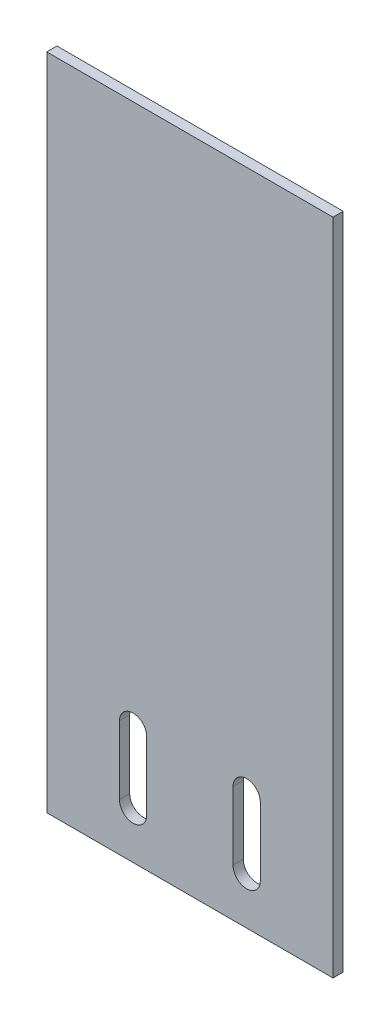
ISO-10303-21;
HEADER;
FILE_DESCRIPTION(('STEP AP214'),'2;1');
FILE_NAME('part.step','',(''),(''),'','','');
FILE_SCHEMA(('AUTOMOTIVE_DESIGN { 1 0 10303 214 1 1 1 1 }'));
ENDSEC;
DATA;
#1=APPLICATION_CONTEXT('core data for automotive mechanical design processes');
#2=APPLICATION_PROTOCOL_DEFINITION('international standard','automotive_design',2000,#1);
#3=PRODUCT_CONTEXT('',#1,'mechanical');
#4=PRODUCT('Part','Part','',(#3));
#5=PRODUCT_RELATED_PRODUCT_CATEGORY('part','',(#4));
#6=PRODUCT_DEFINITION_FORMATION('','',#4);
#7=PRODUCT_DEFINITION_CONTEXT('part definition',#1,'design');
#8=PRODUCT_DEFINITION('design','',#6,#7);
#9=PRODUCT_DEFINITION_SHAPE('','',#8);
#10=(LENGTH_UNIT() NAMED_UNIT(*) SI_UNIT(.MILLI.,.METRE.));
#11=(NAMED_UNIT(*) PLANE_ANGLE_UNIT() SI_UNIT($,.RADIAN.));
#12=(NAMED_UNIT(*) SI_UNIT($,.STERADIAN.) SOLID_ANGLE_UNIT());
#13=UNCERTAINTY_MEASURE_WITH_UNIT(LENGTH_MEASURE(1.E-05),#10,'distance_accuracy_value','');
#14=(GEOMETRIC_REPRESENTATION_CONTEXT(3) GLOBAL_UNCERTAINTY_ASSIGNED_CONTEXT((#13)) GLOBAL_UNIT_ASSIGNED_CONTEXT((#10,
#11,#12)) REPRESENTATION_CONTEXT('',''));
#15=CARTESIAN_POINT('',(0.,0.,0.));
#16=DIRECTION('',(0.,0.,1.));
#17=DIRECTION('',(1.,0.,0.));
#18=AXIS2_PLACEMENT_3D('',#15,#16,#17);
#19=CARTESIAN_POINT('',(19.,0.,4.5));
#20=DIRECTION('',(-1.,0.,0.));
#21=DIRECTION('',(0.,-1.,0.));
#22=AXIS2_PLACEMENT_3D('',#19,#20,#21);
#23=PLANE('',#22);
#24=DIRECTION('',(0.,1.,0.));
#25=VECTOR('',#24,1.);
#26=CARTESIAN_POINT('',(19.,0.,0.));
#27=LINE('',#26,#25);
#28=CARTESIAN_POINT('',(19.,-124.,0.));
#29=VERTEX_POINT('',#28);
#30=CARTESIAN_POINT('',(19.,-94.,0.));
#31=VERTEX_POINT('',#30);
#32=EDGE_CURVE('E178',#29,#31,#27,.T.);
#33=ORIENTED_EDGE('',*,*,#32,.T.);
#34=DIRECTION('',(0.,0.,-1.));
#35=VECTOR('',#34,1.);
#36=CARTESIAN_POINT('',(19.,-94.,4.5));
#37=LINE('',#36,#35);
#38=CARTESIAN_POINT('',(19.,-94.,4.5));
#39=VERTEX_POINT('',#38);
#40=EDGE_CURVE('E11',#39,#31,#37,.T.);
#41=ORIENTED_EDGE('',*,*,#40,.F.);
#42=DIRECTION('',(0.,1.,0.));
#43=VECTOR('',#42,1.);
#44=CARTESIAN_POINT('',(19.,0.,4.5));
#45=LINE('',#44,#43);
#46=CARTESIAN_POINT('',(19.,-124.,4.5));
#47=VERTEX_POINT('',#46);
#48=EDGE_CURVE('E138',#47,#39,#45,.T.);
#49=ORIENTED_EDGE('',*,*,#48,.F.);
#50=DIRECTION('',(0.,0.,-1.));
#51=VECTOR('',#50,1.);
#52=CARTESIAN_POINT('',(19.,-124.,4.5));
#53=LINE('',#52,#51);
#54=EDGE_CURVE('E54',#47,#29,#53,.T.);
#55=ORIENTED_EDGE('',*,*,#54,.T.);
#56=EDGE_LOOP('',(#33,#41,#49,#55));
#57=FACE_BOUND('',#56,.T.);
#58=ADVANCED_FACE('F35',(#57),#23,.F.);
#59=CARTESIAN_POINT('',(25.,-94.,4.5));
#60=DIRECTION('',(0.,0.,-1.));
#61=DIRECTION('',(-1.,0.,0.));
#62=AXIS2_PLACEMENT_3D('',#59,#60,#61);
#63=CYLINDRICAL_SURFACE('',#62,6.00000000000001);
#64=CARTESIAN_POINT('',(25.,-94.,0.));
#65=DIRECTION('',(0.,0.,1.));
#66=DIRECTION('',(1.,0.,0.));
#67=AXIS2_PLACEMENT_3D('',#64,#65,#66);
#68=CIRCLE('',#67,6.00000000000001);
#69=CARTESIAN_POINT('',(31.,-94.,0.));
#70=VERTEX_POINT('',#69);
#71=EDGE_CURVE('E144',#31,#70,#68,.F.);
#72=ORIENTED_EDGE('',*,*,#71,.T.);
#73=DIRECTION('',(0.,0.,-1.));
#74=VECTOR('',#73,1.);
#75=CARTESIAN_POINT('',(31.,-94.,4.5));
#76=LINE('',#75,#74);
#77=CARTESIAN_POINT('',(31.,-94.,4.5));
#78=VERTEX_POINT('',#77);
#79=EDGE_CURVE('E45',#78,#70,#76,.T.);
#80=ORIENTED_EDGE('',*,*,#79,.F.);
#81=CARTESIAN_POINT('',(25.,-94.,4.5));
#82=DIRECTION('',(0.,0.,1.));
#83=DIRECTION('',(1.,0.,0.));
#84=AXIS2_PLACEMENT_3D('',#81,#82,#83);
#85=CIRCLE('',#84,6.00000000000001);
#86=EDGE_CURVE('E132',#39,#78,#85,.F.);
#87=ORIENTED_EDGE('',*,*,#86,.F.);
#88=ORIENTED_EDGE('',*,*,#40,.T.);
#89=EDGE_LOOP('',(#72,#80,#87,#88));
#90=FACE_BOUND('',#89,.T.);
#91=ADVANCED_FACE('F143',(#90),#63,.F.);
#92=CARTESIAN_POINT('',(31.,0.,4.5));
#93=DIRECTION('',(1.,0.,0.));
#94=DIRECTION('',(0.,0.,-1.));
#95=AXIS2_PLACEMENT_3D('',#92,#93,#94);
#96=PLANE('',#95);
#97=DIRECTION('',(0.,-1.,0.));
#98=VECTOR('',#97,1.);
#99=CARTESIAN_POINT('',(31.,0.,0.));
#100=LINE('',#99,#98);
#101=CARTESIAN_POINT('',(31.,-124.,0.));
#102=VERTEX_POINT('',#101);
#103=EDGE_CURVE('E181',#70,#102,#100,.T.);
#104=ORIENTED_EDGE('',*,*,#103,.T.);
#105=DIRECTION('',(0.,0.,-1.));
#106=VECTOR('',#105,1.);
#107=CARTESIAN_POINT('',(31.,-124.,4.5));
#108=LINE('',#107,#106);
#109=CARTESIAN_POINT('',(31.,-124.,4.5));
#110=VERTEX_POINT('',#109);
#111=EDGE_CURVE('E93',#110,#102,#108,.T.);
#112=ORIENTED_EDGE('',*,*,#111,.F.);
#113=DIRECTION('',(0.,-1.,0.));
#114=VECTOR('',#113,1.);
#115=CARTESIAN_POINT('',(31.,0.,4.5));
#116=LINE('',#115,#114);
#117=EDGE_CURVE('E137',#78,#110,#116,.T.);
#118=ORIENTED_EDGE('',*,*,#117,.F.);
#119=ORIENTED_EDGE('',*,*,#79,.T.);
#120=EDGE_LOOP('',(#104,#112,#118,#119));
#121=FACE_BOUND('',#120,.T.);
#122=ADVANCED_FACE('F148',(#121),#96,.F.);
#123=CARTESIAN_POINT('',(-19.,0.,4.5));
#124=DIRECTION('',(-1.,0.,0.));
#125=DIRECTION('',(0.,0.,1.));
#126=AXIS2_PLACEMENT_3D('',#123,#124,#125);
#127=PLANE('',#126);
#128=DIRECTION('',(0.,1.,0.));
#129=VECTOR('',#128,1.);
#130=CARTESIAN_POINT('',(-19.,0.,0.));
#131=LINE('',#130,#129);
#132=CARTESIAN_POINT('',(-19.,-124.,0.));
#133=VERTEX_POINT('',#132);
#134=CARTESIAN_POINT('',(-19.,-94.,0.));
#135=VERTEX_POINT('',#134);
#136=EDGE_CURVE('E166',#133,#135,#131,.T.);
#137=ORIENTED_EDGE('',*,*,#136,.F.);
#138=DIRECTION('',(0.,0.,-1.));
#139=VECTOR('',#138,1.);
#140=CARTESIAN_POINT('',(-19.,-124.,4.5));
#141=LINE('',#140,#139);
#142=CARTESIAN_POINT('',(-19.,-124.,4.5));
#143=VERTEX_POINT('',#142);
#144=EDGE_CURVE('E188',#143,#133,#141,.T.);
#145=ORIENTED_EDGE('',*,*,#144,.F.);
#146=DIRECTION('',(0.,1.,0.));
#147=VECTOR('',#146,1.);
#148=CARTESIAN_POINT('',(-19.,0.,4.5));
#149=LINE('',#148,#147);
#150=CARTESIAN_POINT('',(-19.,-94.,4.5));
#151=VERTEX_POINT('',#150);
#152=EDGE_CURVE('E222',#143,#151,#149,.T.);
#153=ORIENTED_EDGE('',*,*,#152,.T.);
#154=DIRECTION('',(0.,0.,-1.));
#155=VECTOR('',#154,1.);
#156=CARTESIAN_POINT('',(-19.,-94.,4.5));
#157=LINE('',#156,#155);
#158=EDGE_CURVE('E190',#151,#135,#157,.T.);
#159=ORIENTED_EDGE('',*,*,#158,.T.);
#160=EDGE_LOOP('',(#137,#145,#153,#159));
#161=FACE_BOUND('',#160,.T.);
#162=ADVANCED_FACE('F253',(#161),#127,.T.);
#163=CARTESIAN_POINT('',(-25.,-124.,4.5));
#164=DIRECTION('',(0.,0.,-1.));
#165=DIRECTION('',(-1.,0.,0.));
#166=AXIS2_PLACEMENT_3D('',#163,#164,#165);
#167=CYLINDRICAL_SURFACE('',#166,6.);
#168=CARTESIAN_POINT('',(-25.,-124.,0.));
#169=DIRECTION('',(0.,0.,1.));
#170=DIRECTION('',(1.,0.,0.));
#171=AXIS2_PLACEMENT_3D('',#168,#169,#170);
#172=CIRCLE('',#171,6.);
#173=CARTESIAN_POINT('',(-31.,-124.,0.));
#174=VERTEX_POINT('',#173);
#175=EDGE_CURVE('E169',#133,#174,#172,.F.);
#176=ORIENTED_EDGE('',*,*,#175,.T.);
#177=DIRECTION('',(0.,0.,-1.));
#178=VECTOR('',#177,1.);
#179=CARTESIAN_POINT('',(-31.,-124.,4.5));
#180=LINE('',#179,#178);
#181=CARTESIAN_POINT('',(-31.,-124.,4.5));
#182=VERTEX_POINT('',#181);
#183=EDGE_CURVE('E194',#182,#174,#180,.T.);
#184=ORIENTED_EDGE('',*,*,#183,.F.);
#185=CARTESIAN_POINT('',(-25.,-124.,4.5));
#186=DIRECTION('',(0.,0.,1.));
#187=DIRECTION('',(1.,0.,0.));
#188=AXIS2_PLACEMENT_3D('',#185,#186,#187);
#189=CIRCLE('',#188,6.);
#190=EDGE_CURVE('E226',#143,#182,#189,.F.);
#191=ORIENTED_EDGE('',*,*,#190,.F.);
#192=ORIENTED_EDGE('',*,*,#144,.T.);
#193=EDGE_LOOP('',(#176,#184,#191,#192));
#194=FACE_BOUND('',#193,.T.);
#195=ADVANCED_FACE('F255',(#194),#167,.F.);
#196=CARTESIAN_POINT('',(-31.,0.,4.5));
#197=DIRECTION('',(1.,0.,0.));
#198=DIRECTION('',(0.,1.,0.));
#199=AXIS2_PLACEMENT_3D('',#196,#197,#198);
#200=PLANE('',#199);
#201=DIRECTION('',(0.,-1.,0.));
#202=VECTOR('',#201,1.);
#203=CARTESIAN_POINT('',(-31.,0.,0.));
#204=LINE('',#203,#202);
#205=CARTESIAN_POINT('',(-31.,-94.,0.));
#206=VERTEX_POINT('',#205);
#207=EDGE_CURVE('E172',#206,#174,#204,.T.);
#208=ORIENTED_EDGE('',*,*,#207,.F.);
#209=DIRECTION('',(0.,0.,-1.));
#210=VECTOR('',#209,1.);
#211=CARTESIAN_POINT('',(-31.,-94.,4.5));
#212=LINE('',#211,#210);
#213=CARTESIAN_POINT('',(-31.,-94.,4.5));
#214=VERTEX_POINT('',#213);
#215=EDGE_CURVE('E192',#214,#206,#212,.T.);
#216=ORIENTED_EDGE('',*,*,#215,.F.);
#217=DIRECTION('',(0.,-1.,0.));
#218=VECTOR('',#217,1.);
#219=CARTESIAN_POINT('',(-31.,0.,4.5));
#220=LINE('',#219,#218);
#221=EDGE_CURVE('E232',#214,#182,#220,.T.);
#222=ORIENTED_EDGE('',*,*,#221,.T.);
#223=ORIENTED_EDGE('',*,*,#183,.T.);
#224=EDGE_LOOP('',(#208,#216,#222,#223));
#225=FACE_BOUND('',#224,.T.);
#226=ADVANCED_FACE('F248',(#225),#200,.T.);
#227=CARTESIAN_POINT('',(62.9999999999999,0.,4.5));
#228=DIRECTION('',(1.,0.,0.));
#229=DIRECTION('',(0.,0.,-1.));
#230=AXIS2_PLACEMENT_3D('',#227,#228,#229);
#231=PLANE('',#230);
#232=DIRECTION('',(0.,-1.,0.));
#233=VECTOR('',#232,1.);
#234=CARTESIAN_POINT('',(62.9999999999999,0.,0.));
#235=LINE('',#234,#233);
#236=CARTESIAN_POINT('',(62.9999999999999,145.,0.));
#237=VERTEX_POINT('',#236);
#238=CARTESIAN_POINT('',(62.9999999999999,-145.,0.));
#239=VERTEX_POINT('',#238);
#240=EDGE_CURVE('E155',#237,#239,#235,.T.);
#241=ORIENTED_EDGE('',*,*,#240,.F.);
#242=DIRECTION('',(0.,0.,-1.));
#243=VECTOR('',#242,1.);
#244=CARTESIAN_POINT('',(62.9999999999999,145.,4.5));
#245=LINE('',#244,#243);
#246=CARTESIAN_POINT('',(62.9999999999999,145.,4.5));
#247=VERTEX_POINT('',#246);
#248=EDGE_CURVE('E39',#247,#237,#245,.T.);
#249=ORIENTED_EDGE('',*,*,#248,.F.);
#250=DIRECTION('',(0.,-1.,0.));
#251=VECTOR('',#250,1.);
#252=CARTESIAN_POINT('',(62.9999999999999,0.,4.5));
#253=LINE('',#252,#251);
#254=CARTESIAN_POINT('',(62.9999999999999,-145.,4.5));
#255=VERTEX_POINT('',#254);
#256=EDGE_CURVE('E186',#247,#255,#253,.T.);
#257=ORIENTED_EDGE('',*,*,#256,.T.);
#258=DIRECTION('',(0.,0.,-1.));
#259=VECTOR('',#258,1.);
#260=CARTESIAN_POINT('',(62.9999999999999,-145.,4.5));
#261=LINE('',#260,#259);
#262=EDGE_CURVE('E151',#255,#239,#261,.T.);
#263=ORIENTED_EDGE('',*,*,#262,.T.);
#264=EDGE_LOOP('',(#241,#249,#257,#263));
#265=FACE_BOUND('',#264,.T.);
#266=ADVANCED_FACE('F37',(#265),#231,.T.);
#267=CARTESIAN_POINT('',(0.,145.,4.5));
#268=DIRECTION('',(0.,1.,0.));
#269=DIRECTION('',(0.,0.,1.));
#270=AXIS2_PLACEMENT_3D('',#267,#268,#269);
#271=PLANE('',#270);
#272=DIRECTION('',(1.,0.,0.));
#273=VECTOR('',#272,1.);
#274=CARTESIAN_POINT('',(0.,145.,0.));
#275=LINE('',#274,#273);
#276=CARTESIAN_POINT('',(-62.9999999999999,145.,0.));
#277=VERTEX_POINT('',#276);
#278=EDGE_CURVE('E158',#277,#237,#275,.T.);
#279=ORIENTED_EDGE('',*,*,#278,.F.);
#280=DIRECTION('',(0.,0.,-1.));
#281=VECTOR('',#280,1.);
#282=CARTESIAN_POINT('',(-62.9999999999999,145.,4.5));
#283=LINE('',#282,#281);
#284=CARTESIAN_POINT('',(-62.9999999999999,145.,4.5));
#285=VERTEX_POINT('',#284);
#286=EDGE_CURVE('E200',#285,#277,#283,.T.);
#287=ORIENTED_EDGE('',*,*,#286,.F.);
#288=DIRECTION('',(1.,0.,0.));
#289=VECTOR('',#288,1.);
#290=CARTESIAN_POINT('',(0.,145.,4.5));
#291=LINE('',#290,#289);
#292=EDGE_CURVE('E209',#285,#247,#291,.T.);
#293=ORIENTED_EDGE('',*,*,#292,.T.);
#294=ORIENTED_EDGE('',*,*,#248,.T.);
#295=EDGE_LOOP('',(#279,#287,#293,#294));
#296=FACE_BOUND('',#295,.T.);
#297=ADVANCED_FACE('F207',(#296),#271,.T.);
#298=CARTESIAN_POINT('',(-62.9999999999999,0.,4.5));
#299=DIRECTION('',(1.,0.,0.));
#300=DIRECTION('',(0.,0.,-1.));
#301=AXIS2_PLACEMENT_3D('',#298,#299,#300);
#302=PLANE('',#301);
#303=DIRECTION('',(0.,-1.,0.));
#304=VECTOR('',#303,1.);
#305=CARTESIAN_POINT('',(-62.9999999999999,0.,0.));
#306=LINE('',#305,#304);
#307=CARTESIAN_POINT('',(-62.9999999999999,-145.,0.));
#308=VERTEX_POINT('',#307);
#309=EDGE_CURVE('E161',#277,#308,#306,.T.);
#310=ORIENTED_EDGE('',*,*,#309,.T.);
#311=DIRECTION('',(0.,0.,-1.));
#312=VECTOR('',#311,1.);
#313=CARTESIAN_POINT('',(-62.9999999999999,-145.,4.5));
#314=LINE('',#313,#312);
#315=CARTESIAN_POINT('',(-62.9999999999999,-145.,4.5));
#316=VERTEX_POINT('',#315);
#317=EDGE_CURVE('E198',#316,#308,#314,.T.);
#318=ORIENTED_EDGE('',*,*,#317,.F.);
#319=DIRECTION('',(0.,-1.,0.));
#320=VECTOR('',#319,1.);
#321=CARTESIAN_POINT('',(-62.9999999999999,0.,4.5));
#322=LINE('',#321,#320);
#323=EDGE_CURVE('E223',#285,#316,#322,.T.);
#324=ORIENTED_EDGE('',*,*,#323,.F.);
#325=ORIENTED_EDGE('',*,*,#286,.T.);
#326=EDGE_LOOP('',(#310,#318,#324,#325));
#327=FACE_BOUND('',#326,.T.);
#328=ADVANCED_FACE('F216',(#327),#302,.F.);
#329=CARTESIAN_POINT('',(-25.,-94.,4.5));
#330=DIRECTION('',(0.,0.,-1.));
#331=DIRECTION('',(-1.,0.,0.));
#332=AXIS2_PLACEMENT_3D('',#329,#330,#331);
#333=CYLINDRICAL_SURFACE('',#332,6.00000000000001);
#334=CARTESIAN_POINT('',(-25.,-94.,0.));
#335=DIRECTION('',(0.,0.,1.));
#336=DIRECTION('',(1.,0.,0.));
#337=AXIS2_PLACEMENT_3D('',#334,#335,#336);
#338=CIRCLE('',#337,6.00000000000001);
#339=EDGE_CURVE('E175',#135,#206,#338,.T.);
#340=ORIENTED_EDGE('',*,*,#339,.F.);
#341=ORIENTED_EDGE('',*,*,#158,.F.);
#342=CARTESIAN_POINT('',(-25.,-94.,4.5));
#343=DIRECTION('',(0.,0.,1.));
#344=DIRECTION('',(1.,0.,0.));
#345=AXIS2_PLACEMENT_3D('',#342,#343,#344);
#346=CIRCLE('',#345,6.00000000000001);
#347=EDGE_CURVE('E235',#151,#214,#346,.T.);
#348=ORIENTED_EDGE('',*,*,#347,.T.);
#349=ORIENTED_EDGE('',*,*,#215,.T.);
#350=EDGE_LOOP('',(#340,#341,#348,#349));
#351=FACE_BOUND('',#350,.T.);
#352=ADVANCED_FACE('F240',(#351),#333,.F.);
#353=CARTESIAN_POINT('',(0.,-145.,4.5));
#354=DIRECTION('',(0.,1.,0.));
#355=DIRECTION('',(0.,0.,1.));
#356=AXIS2_PLACEMENT_3D('',#353,#354,#355);
#357=PLANE('',#356);
#358=DIRECTION('',(1.,0.,0.));
#359=VECTOR('',#358,1.);
#360=CARTESIAN_POINT('',(0.,-145.,0.));
#361=LINE('',#360,#359);
#362=EDGE_CURVE('E163',#308,#239,#361,.T.);
#363=ORIENTED_EDGE('',*,*,#362,.T.);
#364=ORIENTED_EDGE('',*,*,#262,.F.);
#365=DIRECTION('',(1.,0.,0.));
#366=VECTOR('',#365,1.);
#367=CARTESIAN_POINT('',(0.,-145.,4.5));
#368=LINE('',#367,#366);
#369=EDGE_CURVE('E220',#316,#255,#368,.T.);
#370=ORIENTED_EDGE('',*,*,#369,.F.);
#371=ORIENTED_EDGE('',*,*,#317,.T.);
#372=EDGE_LOOP('',(#363,#364,#370,#371));
#373=FACE_BOUND('',#372,.T.);
#374=ADVANCED_FACE('F219',(#373),#357,.F.);
#375=CARTESIAN_POINT('',(25.,-124.,4.5));
#376=DIRECTION('',(0.,0.,-1.));
#377=DIRECTION('',(-1.,0.,0.));
#378=AXIS2_PLACEMENT_3D('',#375,#376,#377);
#379=CYLINDRICAL_SURFACE('',#378,6.);
#380=CARTESIAN_POINT('',(25.,-124.,0.));
#381=DIRECTION('',(0.,0.,1.));
#382=DIRECTION('',(1.,0.,0.));
#383=AXIS2_PLACEMENT_3D('',#380,#381,#382);
#384=CIRCLE('',#383,6.);
#385=EDGE_CURVE('E183',#29,#102,#384,.T.);
#386=ORIENTED_EDGE('',*,*,#385,.F.);
#387=ORIENTED_EDGE('',*,*,#54,.F.);
#388=CARTESIAN_POINT('',(25.,-124.,4.5));
#389=DIRECTION('',(0.,0.,1.));
#390=DIRECTION('',(1.,0.,0.));
#391=AXIS2_PLACEMENT_3D('',#388,#389,#390);
#392=CIRCLE('',#391,6.);
#393=EDGE_CURVE('E149',#47,#110,#392,.T.);
#394=ORIENTED_EDGE('',*,*,#393,.T.);
#395=ORIENTED_EDGE('',*,*,#111,.T.);
#396=EDGE_LOOP('',(#386,#387,#394,#395));
#397=FACE_BOUND('',#396,.T.);
#398=ADVANCED_FACE('F277',(#397),#379,.F.);
#399=CARTESIAN_POINT('',(0.,0.,4.5));
#400=DIRECTION('',(0.,0.,1.));
#401=DIRECTION('',(1.,0.,0.));
#402=AXIS2_PLACEMENT_3D('',#399,#400,#401);
#403=PLANE('',#402);
#404=ORIENTED_EDGE('',*,*,#256,.F.);
#405=ORIENTED_EDGE('',*,*,#292,.F.);
#406=ORIENTED_EDGE('',*,*,#323,.T.);
#407=ORIENTED_EDGE('',*,*,#369,.T.);
#408=EDGE_LOOP('',(#404,#405,#406,#407));
#409=FACE_BOUND('',#408,.T.);
#410=ORIENTED_EDGE('',*,*,#152,.F.);
#411=ORIENTED_EDGE('',*,*,#190,.T.);
#412=ORIENTED_EDGE('',*,*,#221,.F.);
#413=ORIENTED_EDGE('',*,*,#347,.F.);
#414=EDGE_LOOP('',(#410,#411,#412,#413));
#415=FACE_BOUND('',#414,.T.);
#416=ORIENTED_EDGE('',*,*,#48,.T.);
#417=ORIENTED_EDGE('',*,*,#86,.T.);
#418=ORIENTED_EDGE('',*,*,#117,.T.);
#419=ORIENTED_EDGE('',*,*,#393,.F.);
#420=EDGE_LOOP('',(#416,#417,#418,#419));
#421=FACE_BOUND('',#420,.T.);
#422=ADVANCED_FACE('F134',(#409,#415,#421),#403,.T.);
#423=CARTESIAN_POINT('',(0.,0.,0.));
#424=DIRECTION('',(0.,0.,1.));
#425=DIRECTION('',(1.,0.,0.));
#426=AXIS2_PLACEMENT_3D('',#423,#424,#425);
#427=PLANE('',#426);
#428=ORIENTED_EDGE('',*,*,#240,.T.);
#429=ORIENTED_EDGE('',*,*,#362,.F.);
#430=ORIENTED_EDGE('',*,*,#309,.F.);
#431=ORIENTED_EDGE('',*,*,#278,.T.);
#432=EDGE_LOOP('',(#428,#429,#430,#431));
#433=FACE_BOUND('',#432,.T.);
#434=ORIENTED_EDGE('',*,*,#136,.T.);
#435=ORIENTED_EDGE('',*,*,#339,.T.);
#436=ORIENTED_EDGE('',*,*,#207,.T.);
#437=ORIENTED_EDGE('',*,*,#175,.F.);
#438=EDGE_LOOP('',(#434,#435,#436,#437));
#439=FACE_BOUND('',#438,.T.);
#440=ORIENTED_EDGE('',*,*,#32,.F.);
#441=ORIENTED_EDGE('',*,*,#385,.T.);
#442=ORIENTED_EDGE('',*,*,#103,.F.);
#443=ORIENTED_EDGE('',*,*,#71,.F.);
#444=EDGE_LOOP('',(#440,#441,#442,#443));
#445=FACE_BOUND('',#444,.T.);
#446=ADVANCED_FACE('F213',(#433,#439,#445),#427,.F.);
#447=CLOSED_SHELL('',(#58,#91,#122,#162,#195,#226,#266,#297,#328,#352,#374,#398,#422,#446));
#448=MANIFOLD_SOLID_BREP('B2',#447);
#449=ADVANCED_BREP_SHAPE_REPRESENTATION('',(#18,#448),#14);
#450=SHAPE_DEFINITION_REPRESENTATION(#9,#449);
ENDSEC;
END-ISO-10303-21;
